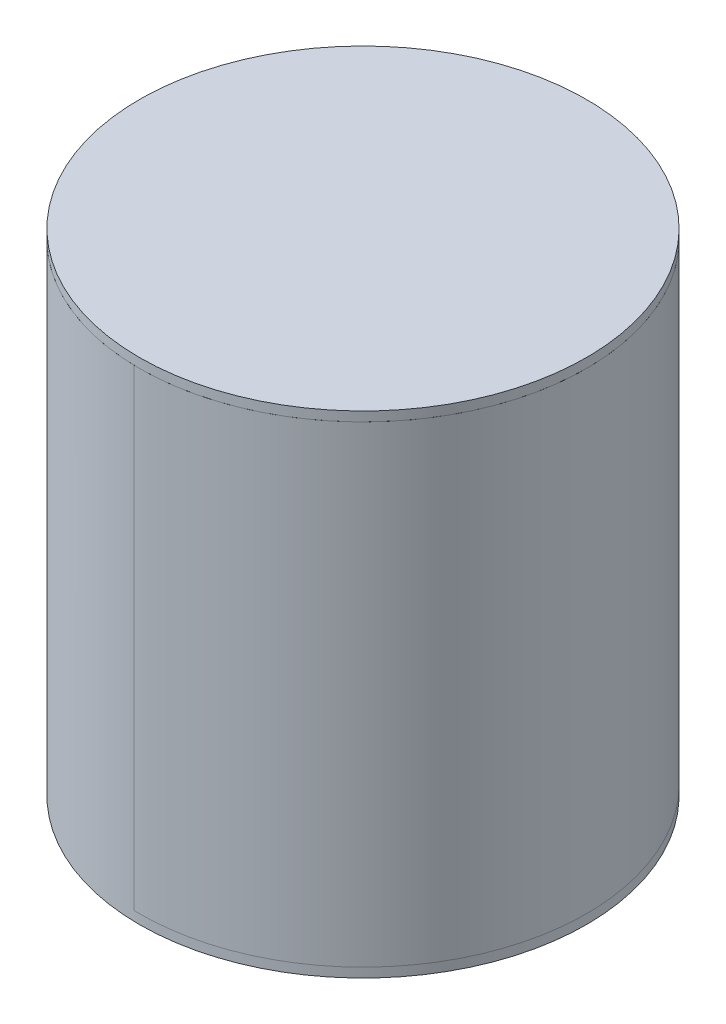
ISO-10303-21;
HEADER;
FILE_DESCRIPTION(('STEP AP214'),'2;1');
FILE_NAME('part.step','',(''),(''),'','','');
FILE_SCHEMA(('AUTOMOTIVE_DESIGN { 1 0 10303 214 1 1 1 1 }'));
ENDSEC;
DATA;
#1=APPLICATION_CONTEXT('core data for automotive mechanical design processes');
#2=APPLICATION_PROTOCOL_DEFINITION('international standard','automotive_design',2000,#1);
#3=PRODUCT_CONTEXT('',#1,'mechanical');
#4=PRODUCT('Part','Part','',(#3));
#5=PRODUCT_RELATED_PRODUCT_CATEGORY('part','',(#4));
#6=PRODUCT_DEFINITION_FORMATION('','',#4);
#7=PRODUCT_DEFINITION_CONTEXT('part definition',#1,'design');
#8=PRODUCT_DEFINITION('design','',#6,#7);
#9=PRODUCT_DEFINITION_SHAPE('','',#8);
#10=(LENGTH_UNIT() NAMED_UNIT(*) SI_UNIT(.MILLI.,.METRE.));
#11=(NAMED_UNIT(*) PLANE_ANGLE_UNIT() SI_UNIT($,.RADIAN.));
#12=(NAMED_UNIT(*) SI_UNIT($,.STERADIAN.) SOLID_ANGLE_UNIT());
#13=UNCERTAINTY_MEASURE_WITH_UNIT(LENGTH_MEASURE(1.E-05),#10,'distance_accuracy_value','');
#14=(GEOMETRIC_REPRESENTATION_CONTEXT(3) GLOBAL_UNCERTAINTY_ASSIGNED_CONTEXT((#13)) GLOBAL_UNIT_ASSIGNED_CONTEXT((#10,
#11,#12)) REPRESENTATION_CONTEXT('',''));
#15=CARTESIAN_POINT('',(0.,0.,0.));
#16=DIRECTION('',(0.,0.,1.));
#17=DIRECTION('',(1.,0.,0.));
#18=AXIS2_PLACEMENT_3D('',#15,#16,#17);
#19=CARTESIAN_POINT('',(0.,156.,0.));
#20=DIRECTION('',(0.,1.,0.));
#21=DIRECTION('',(0.,0.,1.));
#22=AXIS2_PLACEMENT_3D('',#19,#20,#21);
#23=PLANE('',#22);
#24=CARTESIAN_POINT('',(0.,156.,0.));
#25=DIRECTION('',(0.,1.,0.));
#26=DIRECTION('',(0.,0.,1.));
#27=AXIS2_PLACEMENT_3D('',#24,#25,#26);
#28=CIRCLE('',#27,71.);
#29=CARTESIAN_POINT('',(0.,156.,71.));
#30=VERTEX_POINT('',#29);
#31=EDGE_CURVE('E11',#30,#30,#28,.T.);
#32=ORIENTED_EDGE('',*,*,#31,.T.);
#33=EDGE_LOOP('',(#32));
#34=FACE_BOUND('',#33,.T.);
#35=ADVANCED_FACE('F45',(#34),#23,.T.);
#36=CARTESIAN_POINT('',(0.,153.,0.));
#37=DIRECTION('',(0.,1.,0.));
#38=DIRECTION('',(0.,0.,1.));
#39=AXIS2_PLACEMENT_3D('',#36,#37,#38);
#40=PLANE('',#39);
#41=CARTESIAN_POINT('',(0.,153.,0.));
#42=DIRECTION('',(0.,1.,0.));
#43=DIRECTION('',(0.,0.,1.));
#44=AXIS2_PLACEMENT_3D('',#41,#42,#43);
#45=CIRCLE('',#44,71.);
#46=CARTESIAN_POINT('',(0.,153.,71.));
#47=VERTEX_POINT('',#46);
#48=EDGE_CURVE('E49',#47,#47,#45,.T.);
#49=ORIENTED_EDGE('',*,*,#48,.F.);
#50=EDGE_LOOP('',(#49));
#51=FACE_BOUND('',#50,.T.);
#52=CARTESIAN_POINT('',(0.,153.,0.));
#53=DIRECTION('',(0.,1.,0.));
#54=DIRECTION('',(0.,0.,1.));
#55=AXIS2_PLACEMENT_3D('',#52,#53,#54);
#56=CIRCLE('',#55,69.5);
#57=CARTESIAN_POINT('',(0.,153.,69.5));
#58=VERTEX_POINT('',#57);
#59=EDGE_CURVE('E56',#58,#58,#56,.F.);
#60=ORIENTED_EDGE('',*,*,#59,.F.);
#61=EDGE_LOOP('',(#60));
#62=FACE_BOUND('',#61,.T.);
#63=ADVANCED_FACE('F94',(#51,#62),#40,.F.);
#64=CARTESIAN_POINT('',(0.,156.,0.));
#65=DIRECTION('',(0.,-1.,0.));
#66=DIRECTION('',(0.,0.,-1.));
#67=AXIS2_PLACEMENT_3D('',#64,#65,#66);
#68=CYLINDRICAL_SURFACE('',#67,71.);
#69=ORIENTED_EDGE('',*,*,#31,.F.);
#70=EDGE_LOOP('',(#69));
#71=FACE_BOUND('',#70,.T.);
#72=ORIENTED_EDGE('',*,*,#48,.T.);
#73=EDGE_LOOP('',(#72));
#74=FACE_BOUND('',#73,.T.);
#75=ADVANCED_FACE('F47',(#71,#74),#68,.T.);
#76=CARTESIAN_POINT('',(0.,352.57568516986,0.));
#77=DIRECTION('',(0.,-1.,0.));
#78=DIRECTION('',(0.,0.,-1.));
#79=AXIS2_PLACEMENT_3D('',#76,#77,#78);
#80=CYLINDRICAL_SURFACE('',#79,69.5);
#81=CARTESIAN_POINT('',(0.,148.,0.));
#82=DIRECTION('',(0.,1.,0.));
#83=DIRECTION('',(0.,0.,1.));
#84=AXIS2_PLACEMENT_3D('',#81,#82,#83);
#85=CIRCLE('',#84,69.5);
#86=CARTESIAN_POINT('',(0.,148.,69.5));
#87=VERTEX_POINT('',#86);
#88=EDGE_CURVE('E60',#87,#87,#85,.T.);
#89=ORIENTED_EDGE('',*,*,#88,.T.);
#90=EDGE_LOOP('',(#89));
#91=FACE_BOUND('',#90,.T.);
#92=ORIENTED_EDGE('',*,*,#59,.T.);
#93=EDGE_LOOP('',(#92));
#94=FACE_BOUND('',#93,.T.);
#95=ADVANCED_FACE('F90',(#91,#94),#80,.T.);
#96=CARTESIAN_POINT('',(0.,148.,0.));
#97=DIRECTION('',(0.,1.,0.));
#98=DIRECTION('',(0.,0.,1.));
#99=AXIS2_PLACEMENT_3D('',#96,#97,#98);
#100=PLANE('',#99);
#101=CARTESIAN_POINT('',(0.,148.,0.));
#102=DIRECTION('',(0.,1.,0.));
#103=DIRECTION('',(0.,0.,1.));
#104=AXIS2_PLACEMENT_3D('',#101,#102,#103);
#105=CIRCLE('',#104,68.5);
#106=CARTESIAN_POINT('',(0.,148.,68.5));
#107=VERTEX_POINT('',#106);
#108=EDGE_CURVE('E64',#107,#107,#105,.T.);
#109=ORIENTED_EDGE('',*,*,#108,.T.);
#110=EDGE_LOOP('',(#109));
#111=FACE_BOUND('',#110,.T.);
#112=ORIENTED_EDGE('',*,*,#88,.F.);
#113=EDGE_LOOP('',(#112));
#114=FACE_BOUND('',#113,.T.);
#115=ADVANCED_FACE('F82',(#111,#114),#100,.F.);
#116=CARTESIAN_POINT('',(0.,155.,0.));
#117=DIRECTION('',(0.,1.,0.));
#118=DIRECTION('',(0.,0.,1.));
#119=AXIS2_PLACEMENT_3D('',#116,#117,#118);
#120=PLANE('',#119);
#121=CARTESIAN_POINT('',(0.,155.,0.));
#122=DIRECTION('',(0.,1.,0.));
#123=DIRECTION('',(0.,0.,1.));
#124=AXIS2_PLACEMENT_3D('',#121,#122,#123);
#125=CIRCLE('',#124,70.);
#126=CARTESIAN_POINT('',(0.,155.,70.));
#127=VERTEX_POINT('',#126);
#128=EDGE_CURVE('E63',#127,#127,#125,.T.);
#129=ORIENTED_EDGE('',*,*,#128,.F.);
#130=EDGE_LOOP('',(#129));
#131=FACE_BOUND('',#130,.T.);
#132=ADVANCED_FACE('F79',(#131),#120,.F.);
#133=CARTESIAN_POINT('',(0.,154.,0.));
#134=DIRECTION('',(0.,1.,0.));
#135=DIRECTION('',(0.,0.,1.));
#136=AXIS2_PLACEMENT_3D('',#133,#134,#135);
#137=PLANE('',#136);
#138=CARTESIAN_POINT('',(0.,154.,0.));
#139=DIRECTION('',(0.,1.,0.));
#140=DIRECTION('',(0.,0.,1.));
#141=AXIS2_PLACEMENT_3D('',#138,#139,#140);
#142=CIRCLE('',#141,70.);
#143=CARTESIAN_POINT('',(0.,154.,70.));
#144=VERTEX_POINT('',#143);
#145=EDGE_CURVE('E70',#144,#144,#142,.T.);
#146=ORIENTED_EDGE('',*,*,#145,.T.);
#147=EDGE_LOOP('',(#146));
#148=FACE_BOUND('',#147,.T.);
#149=CARTESIAN_POINT('',(0.,154.,0.));
#150=DIRECTION('',(0.,1.,0.));
#151=DIRECTION('',(0.,0.,1.));
#152=AXIS2_PLACEMENT_3D('',#149,#150,#151);
#153=CIRCLE('',#152,68.5);
#154=CARTESIAN_POINT('',(0.,154.,68.5));
#155=VERTEX_POINT('',#154);
#156=EDGE_CURVE('E67',#155,#155,#153,.F.);
#157=ORIENTED_EDGE('',*,*,#156,.T.);
#158=EDGE_LOOP('',(#157));
#159=FACE_BOUND('',#158,.T.);
#160=ADVANCED_FACE('F81',(#148,#159),#137,.T.);
#161=CARTESIAN_POINT('',(0.,156.,0.));
#162=DIRECTION('',(0.,-1.,0.));
#163=DIRECTION('',(0.,0.,-1.));
#164=AXIS2_PLACEMENT_3D('',#161,#162,#163);
#165=CYLINDRICAL_SURFACE('',#164,70.);
#166=ORIENTED_EDGE('',*,*,#128,.T.);
#167=EDGE_LOOP('',(#166));
#168=FACE_BOUND('',#167,.T.);
#169=ORIENTED_EDGE('',*,*,#145,.F.);
#170=EDGE_LOOP('',(#169));
#171=FACE_BOUND('',#170,.T.);
#172=ADVANCED_FACE('F76',(#168,#171),#165,.F.);
#173=CARTESIAN_POINT('',(0.,352.57568516986,0.));
#174=DIRECTION('',(0.,-1.,0.));
#175=DIRECTION('',(0.,0.,-1.));
#176=AXIS2_PLACEMENT_3D('',#173,#174,#175);
#177=CYLINDRICAL_SURFACE('',#176,68.5);
#178=ORIENTED_EDGE('',*,*,#108,.F.);
#179=EDGE_LOOP('',(#178));
#180=FACE_BOUND('',#179,.T.);
#181=ORIENTED_EDGE('',*,*,#156,.F.);
#182=EDGE_LOOP('',(#181));
#183=FACE_BOUND('',#182,.T.);
#184=ADVANCED_FACE('F104',(#180,#183),#177,.F.);
#185=CLOSED_SHELL('',(#35,#63,#75,#95,#115,#132,#160,#172,#184));
#186=MANIFOLD_SOLID_BREP('B2',#185);
#187=CARTESIAN_POINT('',(0.,153.,0.));
#188=DIRECTION('',(-0.999709083066093,0.,0.0241194783349952));
#189=DIRECTION('',(0.0241194783349952,0.,0.999709083066093));
#190=AXIS2_PLACEMENT_3D('',#187,#188,#189);
#191=PLANE('',#190);
#192=DIRECTION('',(0.,-1.,0.));
#193=VECTOR('',#192,1.);
#194=CARTESIAN_POINT('',(1.67630374428219,153.,69.4797812730934));
#195=LINE('',#194,#193);
#196=CARTESIAN_POINT('',(1.67630374428219,148.,69.4797812730934));
#197=VERTEX_POINT('',#196);
#198=CARTESIAN_POINT('',(1.67630374428219,3.,69.4797812730934));
#199=VERTEX_POINT('',#198);
#200=EDGE_CURVE('E198',#197,#199,#195,.T.);
#201=ORIENTED_EDGE('',*,*,#200,.F.);
#202=DIRECTION('',(-0.0241194783349952,0.,-0.999709083066093));
#203=VECTOR('',#202,1.);
#204=CARTESIAN_POINT('',(0.,148.,0.));
#205=LINE('',#204,#203);
#206=CARTESIAN_POINT('',(1.64012452677968,148.,67.9802176484943));
#207=VERTEX_POINT('',#206);
#208=EDGE_CURVE('E263',#197,#207,#205,.T.);
#209=ORIENTED_EDGE('',*,*,#208,.T.);
#210=DIRECTION('',(0.,-1.,0.));
#211=VECTOR('',#210,1.);
#212=CARTESIAN_POINT('',(1.64012452677968,153.,67.9802176484943));
#213=LINE('',#212,#211);
#214=CARTESIAN_POINT('',(1.64012452677968,3.,67.9802176484943));
#215=VERTEX_POINT('',#214);
#216=EDGE_CURVE('E294',#207,#215,#213,.T.);
#217=ORIENTED_EDGE('',*,*,#216,.T.);
#218=DIRECTION('',(-0.0241194783349952,0.,-0.999709083066093));
#219=VECTOR('',#218,1.);
#220=CARTESIAN_POINT('',(0.,3.,0.));
#221=LINE('',#220,#219);
#222=EDGE_CURVE('E269',#199,#215,#221,.T.);
#223=ORIENTED_EDGE('',*,*,#222,.F.);
#224=EDGE_LOOP('',(#201,#209,#217,#223));
#225=FACE_BOUND('',#224,.T.);
#226=ADVANCED_FACE('F190',(#225),#191,.T.);
#227=CARTESIAN_POINT('',(0.,153.,0.));
#228=DIRECTION('',(0.999709083066093,0.,0.0241194783349953));
#229=DIRECTION('',(0.0241194783349953,0.,-0.999709083066093));
#230=AXIS2_PLACEMENT_3D('',#227,#228,#229);
#231=PLANE('',#230);
#232=DIRECTION('',(-0.0241194783349953,0.,0.999709083066093));
#233=VECTOR('',#232,1.);
#234=CARTESIAN_POINT('',(0.,148.,0.));
#235=LINE('',#234,#233);
#236=CARTESIAN_POINT('',(1.67630374428217,148.,-69.4797812730934));
#237=VERTEX_POINT('',#236);
#238=CARTESIAN_POINT('',(1.64012452677968,148.,-67.9802176484943));
#239=VERTEX_POINT('',#238);
#240=EDGE_CURVE('E270',#237,#239,#235,.T.);
#241=ORIENTED_EDGE('',*,*,#240,.F.);
#242=DIRECTION('',(0.,-1.,0.));
#243=VECTOR('',#242,1.);
#244=CARTESIAN_POINT('',(1.67630374428217,153.,-69.4797812730934));
#245=LINE('',#244,#243);
#246=CARTESIAN_POINT('',(1.67630374428217,3.,-69.4797812730934));
#247=VERTEX_POINT('',#246);
#248=EDGE_CURVE('E275',#237,#247,#245,.T.);
#249=ORIENTED_EDGE('',*,*,#248,.T.);
#250=DIRECTION('',(-0.0241194783349953,0.,0.999709083066093));
#251=VECTOR('',#250,1.);
#252=CARTESIAN_POINT('',(0.,3.,0.));
#253=LINE('',#252,#251);
#254=CARTESIAN_POINT('',(1.64012452677968,3.,-67.9802176484943));
#255=VERTEX_POINT('',#254);
#256=EDGE_CURVE('E306',#247,#255,#253,.T.);
#257=ORIENTED_EDGE('',*,*,#256,.T.);
#258=DIRECTION('',(0.,-1.,0.));
#259=VECTOR('',#258,1.);
#260=CARTESIAN_POINT('',(1.64012452677968,153.,-67.9802176484943));
#261=LINE('',#260,#259);
#262=EDGE_CURVE('E293',#239,#255,#261,.T.);
#263=ORIENTED_EDGE('',*,*,#262,.F.);
#264=EDGE_LOOP('',(#241,#249,#257,#263));
#265=FACE_BOUND('',#264,.T.);
#266=ADVANCED_FACE('F325',(#265),#231,.F.);
#267=CARTESIAN_POINT('',(0.,153.,0.));
#268=DIRECTION('',(0.,-1.,0.));
#269=DIRECTION('',(0.,0.,-1.));
#270=AXIS2_PLACEMENT_3D('',#267,#268,#269);
#271=CYLINDRICAL_SURFACE('',#270,68.);
#272=ORIENTED_EDGE('',*,*,#216,.F.);
#273=CARTESIAN_POINT('',(0.,148.,0.));
#274=DIRECTION('',(0.,1.,0.));
#275=DIRECTION('',(0.,0.,1.));
#276=AXIS2_PLACEMENT_3D('',#273,#274,#275);
#277=CIRCLE('',#276,68.);
#278=EDGE_CURVE('E43',#207,#239,#277,.T.);
#279=ORIENTED_EDGE('',*,*,#278,.T.);
#280=ORIENTED_EDGE('',*,*,#262,.T.);
#281=CARTESIAN_POINT('',(0.,3.,0.));
#282=DIRECTION('',(0.,1.,0.));
#283=DIRECTION('',(0.,0.,1.));
#284=AXIS2_PLACEMENT_3D('',#281,#282,#283);
#285=CIRCLE('',#284,68.);
#286=EDGE_CURVE('E303',#215,#255,#285,.T.);
#287=ORIENTED_EDGE('',*,*,#286,.F.);
#288=EDGE_LOOP('',(#272,#279,#280,#287));
#289=FACE_BOUND('',#288,.T.);
#290=ADVANCED_FACE('F324',(#289),#271,.F.);
#291=CARTESIAN_POINT('',(0.,153.,0.));
#292=DIRECTION('',(0.,-1.,0.));
#293=DIRECTION('',(0.,0.,-1.));
#294=AXIS2_PLACEMENT_3D('',#291,#292,#293);
#295=CYLINDRICAL_SURFACE('',#294,69.5);
#296=DIRECTION('',(0.,-1.,0.));
#297=VECTOR('',#296,1.);
#298=CARTESIAN_POINT('',(-1.67630374428221,153.,69.4797812730934));
#299=LINE('',#298,#297);
#300=CARTESIAN_POINT('',(-1.67630374428221,153.,69.4797812730934));
#301=VERTEX_POINT('',#300);
#302=CARTESIAN_POINT('',(-1.67630374428221,3.,69.4797812730934));
#303=VERTEX_POINT('',#302);
#304=EDGE_CURVE('E236',#301,#303,#299,.T.);
#305=ORIENTED_EDGE('',*,*,#304,.F.);
#306=CARTESIAN_POINT('',(0.,153.,0.));
#307=DIRECTION('',(0.,1.,0.));
#308=DIRECTION('',(0.,0.,1.));
#309=AXIS2_PLACEMENT_3D('',#306,#307,#308);
#310=CIRCLE('',#309,69.5);
#311=CARTESIAN_POINT('',(-1.67630374428217,153.,-69.4797812730934));
#312=VERTEX_POINT('',#311);
#313=EDGE_CURVE('E206',#301,#312,#310,.T.);
#314=ORIENTED_EDGE('',*,*,#313,.T.);
#315=DIRECTION('',(0.,-1.,0.));
#316=VECTOR('',#315,1.);
#317=CARTESIAN_POINT('',(-1.67630374428217,153.,-69.4797812730934));
#318=LINE('',#317,#316);
#319=CARTESIAN_POINT('',(-1.67630374428217,3.,-69.4797812730934));
#320=VERTEX_POINT('',#319);
#321=EDGE_CURVE('E290',#312,#320,#318,.T.);
#322=ORIENTED_EDGE('',*,*,#321,.T.);
#323=CARTESIAN_POINT('',(0.,3.,0.));
#324=DIRECTION('',(0.,1.,0.));
#325=DIRECTION('',(0.,0.,1.));
#326=AXIS2_PLACEMENT_3D('',#323,#324,#325);
#327=CIRCLE('',#326,69.5);
#328=EDGE_CURVE('E309',#247,#320,#327,.T.);
#329=ORIENTED_EDGE('',*,*,#328,.F.);
#330=ORIENTED_EDGE('',*,*,#248,.F.);
#331=CARTESIAN_POINT('',(0.,148.,0.));
#332=DIRECTION('',(0.,1.,0.));
#333=DIRECTION('',(0.,0.,1.));
#334=AXIS2_PLACEMENT_3D('',#331,#332,#333);
#335=CIRCLE('',#334,69.5);
#336=EDGE_CURVE('E265',#197,#237,#335,.T.);
#337=ORIENTED_EDGE('',*,*,#336,.F.);
#338=ORIENTED_EDGE('',*,*,#200,.T.);
#339=CARTESIAN_POINT('',(0.,3.,0.));
#340=DIRECTION('',(0.,1.,0.));
#341=DIRECTION('',(0.,0.,1.));
#342=AXIS2_PLACEMENT_3D('',#339,#340,#341);
#343=CIRCLE('',#342,69.5);
#344=EDGE_CURVE('E283',#303,#199,#343,.T.);
#345=ORIENTED_EDGE('',*,*,#344,.F.);
#346=EDGE_LOOP('',(#305,#314,#322,#329,#330,#337,#338,#345));
#347=FACE_BOUND('',#346,.T.);
#348=ADVANCED_FACE('F273',(#347),#295,.F.);
#349=CARTESIAN_POINT('',(0.,153.,0.));
#350=DIRECTION('',(-0.999709083066093,0.,-0.0241194783349952));
#351=DIRECTION('',(-0.0241194783349952,0.,0.999709083066093));
#352=AXIS2_PLACEMENT_3D('',#349,#350,#351);
#353=PLANE('',#352);
#354=DIRECTION('',(0.0241194783349952,0.,-0.999709083066093));
#355=VECTOR('',#354,1.);
#356=CARTESIAN_POINT('',(0.,3.,0.));
#357=LINE('',#356,#355);
#358=CARTESIAN_POINT('',(-1.71248296178466,3.,70.9793448976926));
#359=VERTEX_POINT('',#358);
#360=EDGE_CURVE('E316',#359,#303,#357,.T.);
#361=ORIENTED_EDGE('',*,*,#360,.F.);
#362=DIRECTION('',(0.,-1.,0.));
#363=VECTOR('',#362,1.);
#364=CARTESIAN_POINT('',(-1.71248296178466,153.,70.9793448976926));
#365=LINE('',#364,#363);
#366=CARTESIAN_POINT('',(-1.71248296178466,153.,70.9793448976926));
#367=VERTEX_POINT('',#366);
#368=EDGE_CURVE('E280',#367,#359,#365,.T.);
#369=ORIENTED_EDGE('',*,*,#368,.F.);
#370=DIRECTION('',(0.0241194783349952,0.,-0.999709083066093));
#371=VECTOR('',#370,1.);
#372=CARTESIAN_POINT('',(0.,153.,0.));
#373=LINE('',#372,#371);
#374=EDGE_CURVE('E295',#367,#301,#373,.T.);
#375=ORIENTED_EDGE('',*,*,#374,.T.);
#376=ORIENTED_EDGE('',*,*,#304,.T.);
#377=EDGE_LOOP('',(#361,#369,#375,#376));
#378=FACE_BOUND('',#377,.T.);
#379=ADVANCED_FACE('F354',(#378),#353,.T.);
#380=CARTESIAN_POINT('',(0.,153.,0.));
#381=DIRECTION('',(0.,-1.,0.));
#382=DIRECTION('',(0.,0.,-1.));
#383=AXIS2_PLACEMENT_3D('',#380,#381,#382);
#384=CYLINDRICAL_SURFACE('',#383,71.);
#385=CARTESIAN_POINT('',(0.,3.,0.));
#386=DIRECTION('',(0.,1.,0.));
#387=DIRECTION('',(0.,0.,1.));
#388=AXIS2_PLACEMENT_3D('',#385,#386,#387);
#389=CIRCLE('',#388,71.);
#390=CARTESIAN_POINT('',(-1.71248296178468,3.,-70.9793448976926));
#391=VERTEX_POINT('',#390);
#392=EDGE_CURVE('E315',#359,#391,#389,.T.);
#393=ORIENTED_EDGE('',*,*,#392,.T.);
#394=DIRECTION('',(0.,-1.,0.));
#395=VECTOR('',#394,1.);
#396=CARTESIAN_POINT('',(-1.71248296178468,153.,-70.9793448976926));
#397=LINE('',#396,#395);
#398=CARTESIAN_POINT('',(-1.71248296178468,153.,-70.9793448976926));
#399=VERTEX_POINT('',#398);
#400=EDGE_CURVE('E287',#399,#391,#397,.T.);
#401=ORIENTED_EDGE('',*,*,#400,.F.);
#402=CARTESIAN_POINT('',(0.,153.,0.));
#403=DIRECTION('',(0.,1.,0.));
#404=DIRECTION('',(0.,0.,1.));
#405=AXIS2_PLACEMENT_3D('',#402,#403,#404);
#406=CIRCLE('',#405,71.);
#407=EDGE_CURVE('E297',#367,#399,#406,.T.);
#408=ORIENTED_EDGE('',*,*,#407,.F.);
#409=ORIENTED_EDGE('',*,*,#368,.T.);
#410=EDGE_LOOP('',(#393,#401,#408,#409));
#411=FACE_BOUND('',#410,.T.);
#412=ADVANCED_FACE('F350',(#411),#384,.T.);
#413=CARTESIAN_POINT('',(0.,153.,0.));
#414=DIRECTION('',(0.999709083066093,0.,-0.0241194783349952));
#415=DIRECTION('',(-0.0241194783349952,0.,-0.999709083066093));
#416=AXIS2_PLACEMENT_3D('',#413,#414,#415);
#417=PLANE('',#416);
#418=DIRECTION('',(0.0241194783349952,0.,0.999709083066093));
#419=VECTOR('',#418,1.);
#420=CARTESIAN_POINT('',(0.,3.,0.));
#421=LINE('',#420,#419);
#422=EDGE_CURVE('E312',#391,#320,#421,.T.);
#423=ORIENTED_EDGE('',*,*,#422,.T.);
#424=ORIENTED_EDGE('',*,*,#321,.F.);
#425=DIRECTION('',(0.0241194783349952,0.,0.999709083066093));
#426=VECTOR('',#425,1.);
#427=CARTESIAN_POINT('',(0.,153.,0.));
#428=LINE('',#427,#426);
#429=EDGE_CURVE('E248',#399,#312,#428,.T.);
#430=ORIENTED_EDGE('',*,*,#429,.F.);
#431=ORIENTED_EDGE('',*,*,#400,.T.);
#432=EDGE_LOOP('',(#423,#424,#430,#431));
#433=FACE_BOUND('',#432,.T.);
#434=ADVANCED_FACE('F336',(#433),#417,.F.);
#435=CARTESIAN_POINT('',(0.,153.,0.));
#436=DIRECTION('',(0.,1.,0.));
#437=DIRECTION('',(0.,0.,1.));
#438=AXIS2_PLACEMENT_3D('',#435,#436,#437);
#439=PLANE('',#438);
#440=ORIENTED_EDGE('',*,*,#313,.F.);
#441=ORIENTED_EDGE('',*,*,#374,.F.);
#442=ORIENTED_EDGE('',*,*,#407,.T.);
#443=ORIENTED_EDGE('',*,*,#429,.T.);
#444=EDGE_LOOP('',(#440,#441,#442,#443));
#445=FACE_BOUND('',#444,.T.);
#446=ADVANCED_FACE('F329',(#445),#439,.T.);
#447=CARTESIAN_POINT('',(0.,3.,0.));
#448=DIRECTION('',(0.,1.,0.));
#449=DIRECTION('',(0.,0.,1.));
#450=AXIS2_PLACEMENT_3D('',#447,#448,#449);
#451=PLANE('',#450);
#452=ORIENTED_EDGE('',*,*,#222,.T.);
#453=ORIENTED_EDGE('',*,*,#286,.T.);
#454=ORIENTED_EDGE('',*,*,#256,.F.);
#455=ORIENTED_EDGE('',*,*,#328,.T.);
#456=ORIENTED_EDGE('',*,*,#422,.F.);
#457=ORIENTED_EDGE('',*,*,#392,.F.);
#458=ORIENTED_EDGE('',*,*,#360,.T.);
#459=ORIENTED_EDGE('',*,*,#344,.T.);
#460=EDGE_LOOP('',(#452,#453,#454,#455,#456,#457,#458,#459));
#461=FACE_BOUND('',#460,.T.);
#462=ADVANCED_FACE('F327',(#461),#451,.F.);
#463=CARTESIAN_POINT('',(0.,148.,0.));
#464=DIRECTION('',(0.,1.,0.));
#465=DIRECTION('',(0.,0.,1.));
#466=AXIS2_PLACEMENT_3D('',#463,#464,#465);
#467=PLANE('',#466);
#468=ORIENTED_EDGE('',*,*,#336,.T.);
#469=ORIENTED_EDGE('',*,*,#240,.T.);
#470=ORIENTED_EDGE('',*,*,#278,.F.);
#471=ORIENTED_EDGE('',*,*,#208,.F.);
#472=EDGE_LOOP('',(#468,#469,#470,#471));
#473=FACE_BOUND('',#472,.T.);
#474=ADVANCED_FACE('F264',(#473),#467,.T.);
#475=CLOSED_SHELL('',(#226,#266,#290,#348,#379,#412,#434,#446,#462,#474));
#476=MANIFOLD_SOLID_BREP('B6',#475);
#477=CARTESIAN_POINT('',(0.,153.,0.));
#478=DIRECTION('',(0.,-1.,0.));
#479=DIRECTION('',(0.,0.,-1.));
#480=AXIS2_PLACEMENT_3D('',#477,#478,#479);
#481=CYLINDRICAL_SURFACE('',#480,69.5);
#482=CARTESIAN_POINT('',(0.,148.,0.));
#483=DIRECTION('',(0.,1.,0.));
#484=DIRECTION('',(0.,0.,1.));
#485=AXIS2_PLACEMENT_3D('',#482,#483,#484);
#486=CIRCLE('',#485,69.5);
#487=CARTESIAN_POINT('',(-1.67630374428217,148.,69.4797812730934));
#488=VERTEX_POINT('',#487);
#489=CARTESIAN_POINT('',(1.67630374428217,148.,69.4797812730934));
#490=VERTEX_POINT('',#489);
#491=EDGE_CURVE('E497',#488,#490,#486,.T.);
#492=ORIENTED_EDGE('',*,*,#491,.F.);
#493=DIRECTION('',(0.,-1.,0.));
#494=VECTOR('',#493,1.);
#495=CARTESIAN_POINT('',(-1.67630374428217,153.,69.4797812730934));
#496=LINE('',#495,#494);
#497=CARTESIAN_POINT('',(-1.67630374428217,3.,69.4797812730934));
#498=VERTEX_POINT('',#497);
#499=EDGE_CURVE('E522',#488,#498,#496,.T.);
#500=ORIENTED_EDGE('',*,*,#499,.T.);
#501=CARTESIAN_POINT('',(0.,3.,0.));
#502=DIRECTION('',(0.,1.,0.));
#503=DIRECTION('',(0.,0.,1.));
#504=AXIS2_PLACEMENT_3D('',#501,#502,#503);
#505=CIRCLE('',#504,69.5);
#506=CARTESIAN_POINT('',(1.67630374428219,3.,69.4797812730934));
#507=VERTEX_POINT('',#506);
#508=EDGE_CURVE('E521',#498,#507,#505,.T.);
#509=ORIENTED_EDGE('',*,*,#508,.T.);
#510=DIRECTION('',(0.,-1.,0.));
#511=VECTOR('',#510,1.);
#512=CARTESIAN_POINT('',(1.67630374428219,153.,69.4797812730934));
#513=LINE('',#512,#511);
#514=EDGE_CURVE('E513',#490,#507,#513,.T.);
#515=ORIENTED_EDGE('',*,*,#514,.F.);
#516=EDGE_LOOP('',(#492,#500,#509,#515));
#517=FACE_BOUND('',#516,.T.);
#518=ADVANCED_FACE('F423',(#517),#481,.T.);
#519=CARTESIAN_POINT('',(0.,153.,0.));
#520=DIRECTION('',(-0.999709083066093,0.,0.0241194783349952));
#521=DIRECTION('',(0.0241194783349952,0.,0.999709083066093));
#522=AXIS2_PLACEMENT_3D('',#519,#520,#521);
#523=PLANE('',#522);
#524=DIRECTION('',(-0.0241194783349952,0.,-0.999709083066093));
#525=VECTOR('',#524,1.);
#526=CARTESIAN_POINT('',(0.,148.,0.));
#527=LINE('',#526,#525);
#528=CARTESIAN_POINT('',(1.64012452677968,148.,67.9802176484943));
#529=VERTEX_POINT('',#528);
#530=EDGE_CURVE('E500',#490,#529,#527,.T.);
#531=ORIENTED_EDGE('',*,*,#530,.F.);
#532=ORIENTED_EDGE('',*,*,#514,.T.);
#533=DIRECTION('',(-0.0241194783349952,0.,-0.999709083066093));
#534=VECTOR('',#533,1.);
#535=CARTESIAN_POINT('',(0.,3.,0.));
#536=LINE('',#535,#534);
#537=CARTESIAN_POINT('',(1.64012452677968,3.,67.9802176484943));
#538=VERTEX_POINT('',#537);
#539=EDGE_CURVE('E552',#507,#538,#536,.T.);
#540=ORIENTED_EDGE('',*,*,#539,.T.);
#541=DIRECTION('',(0.,-1.,0.));
#542=VECTOR('',#541,1.);
#543=CARTESIAN_POINT('',(1.64012452677968,153.,67.9802176484943));
#544=LINE('',#543,#542);
#545=EDGE_CURVE('E515',#529,#538,#544,.T.);
#546=ORIENTED_EDGE('',*,*,#545,.F.);
#547=EDGE_LOOP('',(#531,#532,#540,#546));
#548=FACE_BOUND('',#547,.T.);
#549=ADVANCED_FACE('F511',(#548),#523,.F.);
#550=CARTESIAN_POINT('',(0.,153.,0.));
#551=DIRECTION('',(0.,-1.,0.));
#552=DIRECTION('',(0.,0.,-1.));
#553=AXIS2_PLACEMENT_3D('',#550,#551,#552);
#554=CYLINDRICAL_SURFACE('',#553,68.);
#555=DIRECTION('',(0.,-1.,0.));
#556=VECTOR('',#555,1.);
#557=CARTESIAN_POINT('',(1.64012452677968,153.,-67.9802176484943));
#558=LINE('',#557,#556);
#559=CARTESIAN_POINT('',(1.64012452677968,148.,-67.9802176484943));
#560=VERTEX_POINT('',#559);
#561=CARTESIAN_POINT('',(1.64012452677968,3.,-67.9802176484943));
#562=VERTEX_POINT('',#561);
#563=EDGE_CURVE('E526',#560,#562,#558,.T.);
#564=ORIENTED_EDGE('',*,*,#563,.F.);
#565=CARTESIAN_POINT('',(0.,148.,0.));
#566=DIRECTION('',(0.,1.,0.));
#567=DIRECTION('',(0.,0.,1.));
#568=AXIS2_PLACEMENT_3D('',#565,#566,#567);
#569=CIRCLE('',#568,68.);
#570=EDGE_CURVE('E517',#560,#529,#569,.T.);
#571=ORIENTED_EDGE('',*,*,#570,.T.);
#572=ORIENTED_EDGE('',*,*,#545,.T.);
#573=CARTESIAN_POINT('',(0.,3.,0.));
#574=DIRECTION('',(0.,1.,0.));
#575=DIRECTION('',(0.,0.,1.));
#576=AXIS2_PLACEMENT_3D('',#573,#574,#575);
#577=CIRCLE('',#576,68.);
#578=EDGE_CURVE('E554',#562,#538,#577,.T.);
#579=ORIENTED_EDGE('',*,*,#578,.F.);
#580=EDGE_LOOP('',(#564,#571,#572,#579));
#581=FACE_BOUND('',#580,.T.);
#582=ADVANCED_FACE('F593',(#581),#554,.F.);
#583=CARTESIAN_POINT('',(0.,153.,0.));
#584=DIRECTION('',(0.999709083066093,0.,0.0241194783349953));
#585=DIRECTION('',(0.0241194783349953,0.,-0.999709083066093));
#586=AXIS2_PLACEMENT_3D('',#583,#584,#585);
#587=PLANE('',#586);
#588=DIRECTION('',(0.,-1.,0.));
#589=VECTOR('',#588,1.);
#590=CARTESIAN_POINT('',(1.67630374428217,153.,-69.4797812730934));
#591=LINE('',#590,#589);
#592=CARTESIAN_POINT('',(1.67630374428217,148.,-69.4797812730934));
#593=VERTEX_POINT('',#592);
#594=CARTESIAN_POINT('',(1.67630374428217,3.,-69.4797812730934));
#595=VERTEX_POINT('',#594);
#596=EDGE_CURVE('E446',#593,#595,#591,.T.);
#597=ORIENTED_EDGE('',*,*,#596,.F.);
#598=DIRECTION('',(-0.0241194783349953,0.,0.999709083066093));
#599=VECTOR('',#598,1.);
#600=CARTESIAN_POINT('',(0.,148.,0.));
#601=LINE('',#600,#599);
#602=EDGE_CURVE('E571',#593,#560,#601,.T.);
#603=ORIENTED_EDGE('',*,*,#602,.T.);
#604=ORIENTED_EDGE('',*,*,#563,.T.);
#605=DIRECTION('',(-0.0241194783349953,0.,0.999709083066093));
#606=VECTOR('',#605,1.);
#607=CARTESIAN_POINT('',(0.,3.,0.));
#608=LINE('',#607,#606);
#609=EDGE_CURVE('E557',#595,#562,#608,.T.);
#610=ORIENTED_EDGE('',*,*,#609,.F.);
#611=EDGE_LOOP('',(#597,#603,#604,#610));
#612=FACE_BOUND('',#611,.T.);
#613=ADVANCED_FACE('F594',(#612),#587,.T.);
#614=CARTESIAN_POINT('',(0.,153.,0.));
#615=DIRECTION('',(0.,-1.,0.));
#616=DIRECTION('',(0.,0.,-1.));
#617=AXIS2_PLACEMENT_3D('',#614,#615,#616);
#618=CYLINDRICAL_SURFACE('',#617,69.5);
#619=CARTESIAN_POINT('',(-1.67630374428215,148.,-69.4797812730934));
#620=VERTEX_POINT('',#619);
#621=EDGE_CURVE('E508',#593,#620,#486,.T.);
#622=ORIENTED_EDGE('',*,*,#621,.F.);
#623=ORIENTED_EDGE('',*,*,#596,.T.);
#624=CARTESIAN_POINT('',(0.,3.,0.));
#625=DIRECTION('',(0.,1.,0.));
#626=DIRECTION('',(0.,0.,1.));
#627=AXIS2_PLACEMENT_3D('',#624,#625,#626);
#628=CIRCLE('',#627,69.5);
#629=CARTESIAN_POINT('',(-1.67630374428215,3.,-69.4797812730934));
#630=VERTEX_POINT('',#629);
#631=EDGE_CURVE('E560',#595,#630,#628,.T.);
#632=ORIENTED_EDGE('',*,*,#631,.T.);
#633=DIRECTION('',(0.,-1.,0.));
#634=VECTOR('',#633,1.);
#635=CARTESIAN_POINT('',(-1.67630374428215,153.,-69.4797812730934));
#636=LINE('',#635,#634);
#637=EDGE_CURVE('E438',#620,#630,#636,.T.);
#638=ORIENTED_EDGE('',*,*,#637,.F.);
#639=EDGE_LOOP('',(#622,#623,#632,#638));
#640=FACE_BOUND('',#639,.T.);
#641=ADVANCED_FACE('F575',(#640),#618,.T.);
#642=CARTESIAN_POINT('',(0.,3.,0.));
#643=DIRECTION('',(0.,1.,0.));
#644=DIRECTION('',(0.,0.,1.));
#645=AXIS2_PLACEMENT_3D('',#642,#643,#644);
#646=PLANE('',#645);
#647=CARTESIAN_POINT('',(0.,3.,0.));
#648=DIRECTION('',(0.,1.,0.));
#649=DIRECTION('',(0.,0.,1.));
#650=AXIS2_PLACEMENT_3D('',#647,#648,#649);
#651=CIRCLE('',#650,71.);
#652=CARTESIAN_POINT('',(-1.71248296178466,3.,70.9793448976926));
#653=VERTEX_POINT('',#652);
#654=CARTESIAN_POINT('',(-1.71248296178466,3.,-70.9793448976926));
#655=VERTEX_POINT('',#654);
#656=EDGE_CURVE('E431',#653,#655,#651,.T.);
#657=ORIENTED_EDGE('',*,*,#656,.T.);
#658=DIRECTION('',(0.0241194783349952,0.,0.999709083066093));
#659=VECTOR('',#658,1.);
#660=CARTESIAN_POINT('',(0.,3.,0.));
#661=LINE('',#660,#659);
#662=EDGE_CURVE('E516',#655,#630,#661,.T.);
#663=ORIENTED_EDGE('',*,*,#662,.T.);
#664=ORIENTED_EDGE('',*,*,#631,.F.);
#665=ORIENTED_EDGE('',*,*,#609,.T.);
#666=ORIENTED_EDGE('',*,*,#578,.T.);
#667=ORIENTED_EDGE('',*,*,#539,.F.);
#668=ORIENTED_EDGE('',*,*,#508,.F.);
#669=DIRECTION('',(0.0241194783349952,0.,-0.999709083066093));
#670=VECTOR('',#669,1.);
#671=CARTESIAN_POINT('',(0.,3.,0.));
#672=LINE('',#671,#670);
#673=EDGE_CURVE('E547',#653,#498,#672,.T.);
#674=ORIENTED_EDGE('',*,*,#673,.F.);
#675=EDGE_LOOP('',(#657,#663,#664,#665,#666,#667,#668,#674));
#676=FACE_BOUND('',#675,.T.);
#677=ADVANCED_FACE('F589',(#676),#646,.T.);
#678=CARTESIAN_POINT('',(0.,3.,0.));
#679=DIRECTION('',(0.,-1.,0.));
#680=DIRECTION('',(0.,0.,-1.));
#681=AXIS2_PLACEMENT_3D('',#678,#679,#680);
#682=CYLINDRICAL_SURFACE('',#681,71.);
#683=ORIENTED_EDGE('',*,*,#656,.F.);
#684=DIRECTION('',(0.,-1.,0.));
#685=VECTOR('',#684,1.);
#686=CARTESIAN_POINT('',(-1.71248296178471,153.,70.9793448976926));
#687=LINE('',#686,#685);
#688=CARTESIAN_POINT('',(-1.71248296178471,153.,70.9793448976926));
#689=VERTEX_POINT('',#688);
#690=EDGE_CURVE('E540',#689,#653,#687,.T.);
#691=ORIENTED_EDGE('',*,*,#690,.F.);
#692=CARTESIAN_POINT('',(0.,153.,0.));
#693=DIRECTION('',(0.,1.,0.));
#694=DIRECTION('',(0.,0.,1.));
#695=AXIS2_PLACEMENT_3D('',#692,#693,#694);
#696=CIRCLE('',#695,71.);
#697=CARTESIAN_POINT('',(-1.71248296178465,153.,-70.9793448976926));
#698=VERTEX_POINT('',#697);
#699=EDGE_CURVE('E563',#698,#689,#696,.T.);
#700=ORIENTED_EDGE('',*,*,#699,.F.);
#701=DIRECTION('',(0.,-1.,0.));
#702=VECTOR('',#701,1.);
#703=CARTESIAN_POINT('',(-1.71248296178465,153.,-70.9793448976926));
#704=LINE('',#703,#702);
#705=EDGE_CURVE('E536',#698,#655,#704,.T.);
#706=ORIENTED_EDGE('',*,*,#705,.T.);
#707=EDGE_LOOP('',(#683,#691,#700,#706));
#708=FACE_BOUND('',#707,.T.);
#709=CARTESIAN_POINT('',(0.,0.,0.));
#710=DIRECTION('',(0.,1.,0.));
#711=DIRECTION('',(0.,0.,1.));
#712=AXIS2_PLACEMENT_3D('',#709,#710,#711);
#713=CIRCLE('',#712,71.);
#714=CARTESIAN_POINT('',(0.,0.,71.));
#715=VERTEX_POINT('',#714);
#716=EDGE_CURVE('E534',#715,#715,#713,.T.);
#717=ORIENTED_EDGE('',*,*,#716,.T.);
#718=EDGE_LOOP('',(#717));
#719=FACE_BOUND('',#718,.T.);
#720=ADVANCED_FACE('F425',(#708,#719),#682,.T.);
#721=CARTESIAN_POINT('',(0.,0.,0.));
#722=DIRECTION('',(0.,1.,0.));
#723=DIRECTION('',(0.,0.,1.));
#724=AXIS2_PLACEMENT_3D('',#721,#722,#723);
#725=PLANE('',#724);
#726=ORIENTED_EDGE('',*,*,#716,.F.);
#727=EDGE_LOOP('',(#726));
#728=FACE_BOUND('',#727,.T.);
#729=ADVANCED_FACE('F670',(#728),#725,.F.);
#730=CARTESIAN_POINT('',(0.,153.,0.));
#731=DIRECTION('',(0.999709083066093,0.,-0.0241194783349952));
#732=DIRECTION('',(-0.0241194783349952,0.,-0.999709083066093));
#733=AXIS2_PLACEMENT_3D('',#730,#731,#732);
#734=PLANE('',#733);
#735=ORIENTED_EDGE('',*,*,#662,.F.);
#736=ORIENTED_EDGE('',*,*,#705,.F.);
#737=DIRECTION('',(0.0241194783349952,0.,0.999709083066093));
#738=VECTOR('',#737,1.);
#739=CARTESIAN_POINT('',(0.,153.,0.));
#740=LINE('',#739,#738);
#741=CARTESIAN_POINT('',(-1.67630374428215,153.,-69.4797812730934));
#742=VERTEX_POINT('',#741);
#743=EDGE_CURVE('E550',#698,#742,#740,.T.);
#744=ORIENTED_EDGE('',*,*,#743,.T.);
#745=EDGE_CURVE('E532',#742,#620,#636,.T.);
#746=ORIENTED_EDGE('',*,*,#745,.T.);
#747=ORIENTED_EDGE('',*,*,#637,.T.);
#748=EDGE_LOOP('',(#735,#736,#744,#746,#747));
#749=FACE_BOUND('',#748,.T.);
#750=ADVANCED_FACE('F576',(#749),#734,.T.);
#751=CARTESIAN_POINT('',(0.,153.,0.));
#752=DIRECTION('',(-0.999709083066093,0.,-0.0241194783349952));
#753=DIRECTION('',(-0.0241194783349952,0.,0.999709083066093));
#754=AXIS2_PLACEMENT_3D('',#751,#752,#753);
#755=PLANE('',#754);
#756=ORIENTED_EDGE('',*,*,#673,.T.);
#757=ORIENTED_EDGE('',*,*,#499,.F.);
#758=CARTESIAN_POINT('',(-1.67630374428217,153.,69.4797812730934));
#759=VERTEX_POINT('',#758);
#760=EDGE_CURVE('E524',#759,#488,#496,.T.);
#761=ORIENTED_EDGE('',*,*,#760,.F.);
#762=DIRECTION('',(0.0241194783349952,0.,-0.999709083066093));
#763=VECTOR('',#762,1.);
#764=CARTESIAN_POINT('',(0.,153.,0.));
#765=LINE('',#764,#763);
#766=EDGE_CURVE('E565',#689,#759,#765,.T.);
#767=ORIENTED_EDGE('',*,*,#766,.F.);
#768=ORIENTED_EDGE('',*,*,#690,.T.);
#769=EDGE_LOOP('',(#756,#757,#761,#767,#768));
#770=FACE_BOUND('',#769,.T.);
#771=ADVANCED_FACE('F587',(#770),#755,.F.);
#772=CARTESIAN_POINT('',(0.,153.,0.));
#773=DIRECTION('',(0.,1.,0.));
#774=DIRECTION('',(0.,0.,1.));
#775=AXIS2_PLACEMENT_3D('',#772,#773,#774);
#776=PLANE('',#775);
#777=CARTESIAN_POINT('',(0.,153.,0.));
#778=DIRECTION('',(0.,1.,0.));
#779=DIRECTION('',(0.,0.,1.));
#780=AXIS2_PLACEMENT_3D('',#777,#778,#779);
#781=CIRCLE('',#780,69.5);
#782=EDGE_CURVE('E188',#742,#759,#781,.T.);
#783=ORIENTED_EDGE('',*,*,#782,.F.);
#784=ORIENTED_EDGE('',*,*,#743,.F.);
#785=ORIENTED_EDGE('',*,*,#699,.T.);
#786=ORIENTED_EDGE('',*,*,#766,.T.);
#787=EDGE_LOOP('',(#783,#784,#785,#786));
#788=FACE_BOUND('',#787,.T.);
#789=ADVANCED_FACE('F582',(#788),#776,.T.);
#790=CARTESIAN_POINT('',(0.,148.,0.));
#791=DIRECTION('',(0.,1.,0.));
#792=DIRECTION('',(0.,0.,1.));
#793=AXIS2_PLACEMENT_3D('',#790,#791,#792);
#794=PLANE('',#793);
#795=ORIENTED_EDGE('',*,*,#530,.T.);
#796=ORIENTED_EDGE('',*,*,#570,.F.);
#797=ORIENTED_EDGE('',*,*,#602,.F.);
#798=ORIENTED_EDGE('',*,*,#621,.T.);
#799=EDGE_CURVE('E503',#620,#488,#486,.T.);
#800=ORIENTED_EDGE('',*,*,#799,.T.);
#801=ORIENTED_EDGE('',*,*,#491,.T.);
#802=EDGE_LOOP('',(#795,#796,#797,#798,#800,#801));
#803=FACE_BOUND('',#802,.T.);
#804=ADVANCED_FACE('F499',(#803),#794,.T.);
#805=CARTESIAN_POINT('',(0.,148.,0.));
#806=DIRECTION('',(0.,1.,0.));
#807=DIRECTION('',(0.,0.,1.));
#808=AXIS2_PLACEMENT_3D('',#805,#806,#807);
#809=CYLINDRICAL_SURFACE('',#808,69.5);
#810=ORIENTED_EDGE('',*,*,#745,.F.);
#811=ORIENTED_EDGE('',*,*,#782,.T.);
#812=ORIENTED_EDGE('',*,*,#760,.T.);
#813=ORIENTED_EDGE('',*,*,#799,.F.);
#814=EDGE_LOOP('',(#810,#811,#812,#813));
#815=FACE_BOUND('',#814,.T.);
#816=ADVANCED_FACE('F580',(#815),#809,.F.);
#817=CLOSED_SHELL('',(#518,#549,#582,#613,#641,#677,#720,#729,#750,#771,#789,#804,#816));
#818=MANIFOLD_SOLID_BREP('B37',#817);
#819=ADVANCED_BREP_SHAPE_REPRESENTATION('',(#18,#186,#476,#818),#14);
#820=SHAPE_DEFINITION_REPRESENTATION(#9,#819);
ENDSEC;
END-ISO-10303-21;
